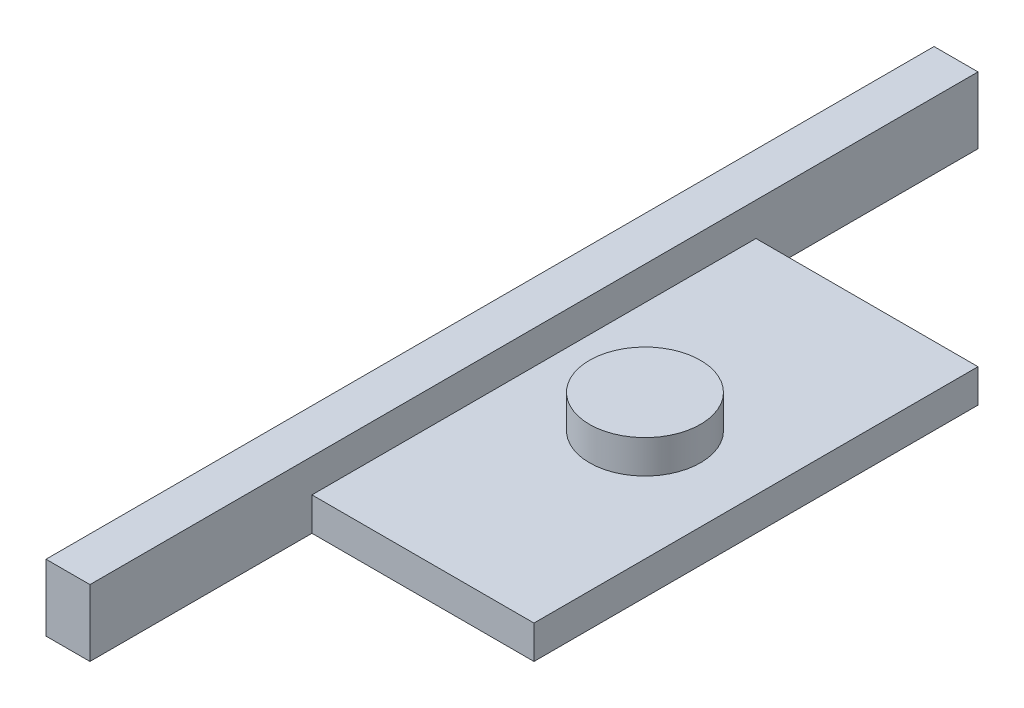
ISO-10303-21;
HEADER;
FILE_DESCRIPTION(('STEP AP214'),'2;1');
FILE_NAME('part.step','',(''),(''),'','','');
FILE_SCHEMA(('AUTOMOTIVE_DESIGN { 1 0 10303 214 1 1 1 1 }'));
ENDSEC;
DATA;
#1=APPLICATION_CONTEXT('core data for automotive mechanical design processes');
#2=APPLICATION_PROTOCOL_DEFINITION('international standard','automotive_design',2000,#1);
#3=PRODUCT_CONTEXT('',#1,'mechanical');
#4=PRODUCT('Part','Part','',(#3));
#5=PRODUCT_RELATED_PRODUCT_CATEGORY('part','',(#4));
#6=PRODUCT_DEFINITION_FORMATION('','',#4);
#7=PRODUCT_DEFINITION_CONTEXT('part definition',#1,'design');
#8=PRODUCT_DEFINITION('design','',#6,#7);
#9=PRODUCT_DEFINITION_SHAPE('','',#8);
#10=(LENGTH_UNIT() NAMED_UNIT(*) SI_UNIT(.MILLI.,.METRE.));
#11=(NAMED_UNIT(*) PLANE_ANGLE_UNIT() SI_UNIT($,.RADIAN.));
#12=(NAMED_UNIT(*) SI_UNIT($,.STERADIAN.) SOLID_ANGLE_UNIT());
#13=UNCERTAINTY_MEASURE_WITH_UNIT(LENGTH_MEASURE(1.E-05),#10,'distance_accuracy_value','');
#14=(GEOMETRIC_REPRESENTATION_CONTEXT(3) GLOBAL_UNCERTAINTY_ASSIGNED_CONTEXT((#13)) GLOBAL_UNIT_ASSIGNED_CONTEXT((#10,
#11,#12)) REPRESENTATION_CONTEXT('',''));
#15=CARTESIAN_POINT('',(0.,0.,0.));
#16=DIRECTION('',(0.,0.,1.));
#17=DIRECTION('',(1.,0.,0.));
#18=AXIS2_PLACEMENT_3D('',#15,#16,#17);
#19=CARTESIAN_POINT('',(75.,3.,10.));
#20=DIRECTION('',(0.,0.,-1.));
#21=DIRECTION('',(-1.,0.,0.));
#22=AXIS2_PLACEMENT_3D('',#19,#20,#21);
#23=PLANE('',#22);
#24=DIRECTION('',(1.,0.,0.));
#25=VECTOR('',#24,1.);
#26=CARTESIAN_POINT('',(75.,1.5,10.));
#27=LINE('',#26,#25);
#28=CARTESIAN_POINT('',(65.,1.5,10.));
#29=VERTEX_POINT('',#28);
#30=CARTESIAN_POINT('',(75.,1.5,10.));
#31=VERTEX_POINT('',#30);
#32=EDGE_CURVE('E134',#29,#31,#27,.T.);
#33=ORIENTED_EDGE('',*,*,#32,.F.);
#34=DIRECTION('',(0.,-1.,0.));
#35=VECTOR('',#34,1.);
#36=CARTESIAN_POINT('',(65.,3.,10.));
#37=LINE('',#36,#35);
#38=CARTESIAN_POINT('',(65.,0.,10.));
#39=VERTEX_POINT('',#38);
#40=EDGE_CURVE('E154',#29,#39,#37,.T.);
#41=ORIENTED_EDGE('',*,*,#40,.T.);
#42=DIRECTION('',(1.,0.,0.));
#43=VECTOR('',#42,1.);
#44=CARTESIAN_POINT('',(75.,0.,10.));
#45=LINE('',#44,#43);
#46=CARTESIAN_POINT('',(75.,0.,10.));
#47=VERTEX_POINT('',#46);
#48=EDGE_CURVE('E141',#39,#47,#45,.T.);
#49=ORIENTED_EDGE('',*,*,#48,.T.);
#50=DIRECTION('',(0.,-1.,0.));
#51=VECTOR('',#50,1.);
#52=CARTESIAN_POINT('',(75.,3.,10.));
#53=LINE('',#52,#51);
#54=EDGE_CURVE('E152',#31,#47,#53,.T.);
#55=ORIENTED_EDGE('',*,*,#54,.F.);
#56=EDGE_LOOP('',(#33,#41,#49,#55));
#57=FACE_BOUND('',#56,.T.);
#58=ADVANCED_FACE('F40',(#57),#23,.F.);
#59=CARTESIAN_POINT('',(75.,3.,-10.));
#60=DIRECTION('',(-1.,0.,0.));
#61=DIRECTION('',(0.,0.,1.));
#62=AXIS2_PLACEMENT_3D('',#59,#60,#61);
#63=PLANE('',#62);
#64=DIRECTION('',(0.,0.,-1.));
#65=VECTOR('',#64,1.);
#66=CARTESIAN_POINT('',(75.,1.5,10.));
#67=LINE('',#66,#65);
#68=CARTESIAN_POINT('',(75.,1.5,-10.));
#69=VERTEX_POINT('',#68);
#70=EDGE_CURVE('E62',#31,#69,#67,.T.);
#71=ORIENTED_EDGE('',*,*,#70,.F.);
#72=ORIENTED_EDGE('',*,*,#54,.T.);
#73=DIRECTION('',(0.,0.,-1.));
#74=VECTOR('',#73,1.);
#75=CARTESIAN_POINT('',(75.,0.,-10.));
#76=LINE('',#75,#74);
#77=CARTESIAN_POINT('',(75.,0.,-10.));
#78=VERTEX_POINT('',#77);
#79=EDGE_CURVE('E144',#47,#78,#76,.T.);
#80=ORIENTED_EDGE('',*,*,#79,.T.);
#81=DIRECTION('',(0.,-1.,0.));
#82=VECTOR('',#81,1.);
#83=CARTESIAN_POINT('',(75.,3.,-10.));
#84=LINE('',#83,#82);
#85=EDGE_CURVE('E150',#69,#78,#84,.T.);
#86=ORIENTED_EDGE('',*,*,#85,.F.);
#87=EDGE_LOOP('',(#71,#72,#80,#86));
#88=FACE_BOUND('',#87,.T.);
#89=ADVANCED_FACE('F186',(#88),#63,.F.);
#90=CARTESIAN_POINT('',(65.,3.,-10.));
#91=DIRECTION('',(0.,0.,1.));
#92=DIRECTION('',(1.,0.,0.));
#93=AXIS2_PLACEMENT_3D('',#90,#91,#92);
#94=PLANE('',#93);
#95=DIRECTION('',(-1.,0.,0.));
#96=VECTOR('',#95,1.);
#97=CARTESIAN_POINT('',(75.,1.5,-10.));
#98=LINE('',#97,#96);
#99=CARTESIAN_POINT('',(65.,1.5,-10.));
#100=VERTEX_POINT('',#99);
#101=EDGE_CURVE('E176',#69,#100,#98,.T.);
#102=ORIENTED_EDGE('',*,*,#101,.F.);
#103=ORIENTED_EDGE('',*,*,#85,.T.);
#104=DIRECTION('',(-1.,0.,0.));
#105=VECTOR('',#104,1.);
#106=CARTESIAN_POINT('',(65.,0.,-10.));
#107=LINE('',#106,#105);
#108=CARTESIAN_POINT('',(65.,0.,-10.));
#109=VERTEX_POINT('',#108);
#110=EDGE_CURVE('E127',#78,#109,#107,.T.);
#111=ORIENTED_EDGE('',*,*,#110,.T.);
#112=DIRECTION('',(0.,-1.,0.));
#113=VECTOR('',#112,1.);
#114=CARTESIAN_POINT('',(65.,3.,-10.));
#115=LINE('',#114,#113);
#116=EDGE_CURVE('E125',#100,#109,#115,.T.);
#117=ORIENTED_EDGE('',*,*,#116,.F.);
#118=EDGE_LOOP('',(#102,#103,#111,#117));
#119=FACE_BOUND('',#118,.T.);
#120=ADVANCED_FACE('F203',(#119),#94,.F.);
#121=CARTESIAN_POINT('',(0.,3.,0.));
#122=DIRECTION('',(0.,-1.,0.));
#123=DIRECTION('',(0.,0.,-1.));
#124=AXIS2_PLACEMENT_3D('',#121,#122,#123);
#125=PLANE('',#124);
#126=DIRECTION('',(-1.,0.,0.));
#127=VECTOR('',#126,1.);
#128=CARTESIAN_POINT('',(-65.,3.,-20.));
#129=LINE('',#128,#127);
#130=CARTESIAN_POINT('',(65.,3.,-20.));
#131=VERTEX_POINT('',#130);
#132=CARTESIAN_POINT('',(63.0204832080686,3.,-20.));
#133=VERTEX_POINT('',#132);
#134=EDGE_CURVE('E115',#131,#133,#129,.T.);
#135=ORIENTED_EDGE('',*,*,#134,.T.);
#136=DIRECTION('',(0.,0.,1.));
#137=VECTOR('',#136,1.);
#138=CARTESIAN_POINT('',(63.0204832080686,3.,0.));
#139=LINE('',#138,#137);
#140=CARTESIAN_POINT('',(63.0204832080686,3.,20.));
#141=VERTEX_POINT('',#140);
#142=EDGE_CURVE('E103',#133,#141,#139,.T.);
#143=ORIENTED_EDGE('',*,*,#142,.T.);
#144=DIRECTION('',(1.,0.,0.));
#145=VECTOR('',#144,1.);
#146=CARTESIAN_POINT('',(-65.,3.,20.));
#147=LINE('',#146,#145);
#148=CARTESIAN_POINT('',(65.,3.,20.));
#149=VERTEX_POINT('',#148);
#150=EDGE_CURVE('E123',#141,#149,#147,.T.);
#151=ORIENTED_EDGE('',*,*,#150,.T.);
#152=DIRECTION('',(0.,0.,-1.));
#153=VECTOR('',#152,1.);
#154=CARTESIAN_POINT('',(65.,3.,-10.));
#155=LINE('',#154,#153);
#156=EDGE_CURVE('E121',#149,#131,#155,.T.);
#157=ORIENTED_EDGE('',*,*,#156,.T.);
#158=EDGE_LOOP('',(#135,#143,#151,#157));
#159=FACE_BOUND('',#158,.T.);
#160=ADVANCED_FACE('F119',(#159),#125,.F.);
#161=CARTESIAN_POINT('',(0.,0.,0.));
#162=DIRECTION('',(0.,-1.,0.));
#163=DIRECTION('',(0.,0.,-1.));
#164=AXIS2_PLACEMENT_3D('',#161,#162,#163);
#165=PLANE('',#164);
#166=DIRECTION('',(0.,0.,1.));
#167=VECTOR('',#166,1.);
#168=CARTESIAN_POINT('',(63.0204832080686,0.,0.));
#169=LINE('',#168,#167);
#170=CARTESIAN_POINT('',(63.0204832080686,0.,-20.));
#171=VERTEX_POINT('',#170);
#172=CARTESIAN_POINT('',(63.0204832080686,0.,20.));
#173=VERTEX_POINT('',#172);
#174=EDGE_CURVE('E55',#171,#173,#169,.T.);
#175=ORIENTED_EDGE('',*,*,#174,.F.);
#176=DIRECTION('',(-1.,0.,0.));
#177=VECTOR('',#176,1.);
#178=CARTESIAN_POINT('',(-65.,0.,-20.));
#179=LINE('',#178,#177);
#180=CARTESIAN_POINT('',(65.,0.,-20.));
#181=VERTEX_POINT('',#180);
#182=EDGE_CURVE('E117',#181,#171,#179,.T.);
#183=ORIENTED_EDGE('',*,*,#182,.F.);
#184=DIRECTION('',(0.,0.,-1.));
#185=VECTOR('',#184,1.);
#186=CARTESIAN_POINT('',(65.,0.,-10.));
#187=LINE('',#186,#185);
#188=EDGE_CURVE('E131',#109,#181,#187,.T.);
#189=ORIENTED_EDGE('',*,*,#188,.F.);
#190=ORIENTED_EDGE('',*,*,#110,.F.);
#191=ORIENTED_EDGE('',*,*,#79,.F.);
#192=ORIENTED_EDGE('',*,*,#48,.F.);
#193=DIRECTION('',(0.,0.,-1.));
#194=VECTOR('',#193,1.);
#195=CARTESIAN_POINT('',(65.,0.,20.));
#196=LINE('',#195,#194);
#197=CARTESIAN_POINT('',(65.,0.,20.));
#198=VERTEX_POINT('',#197);
#199=EDGE_CURVE('E138',#198,#39,#196,.T.);
#200=ORIENTED_EDGE('',*,*,#199,.F.);
#201=DIRECTION('',(1.,0.,0.));
#202=VECTOR('',#201,1.);
#203=CARTESIAN_POINT('',(-65.,0.,20.));
#204=LINE('',#203,#202);
#205=EDGE_CURVE('E136',#173,#198,#204,.T.);
#206=ORIENTED_EDGE('',*,*,#205,.F.);
#207=EDGE_LOOP('',(#175,#183,#189,#190,#191,#192,#200,#206));
#208=FACE_BOUND('',#207,.T.);
#209=ADVANCED_FACE('F164',(#208),#165,.T.);
#210=CARTESIAN_POINT('',(-65.,3.,-20.));
#211=DIRECTION('',(0.,0.,1.));
#212=DIRECTION('',(1.,0.,0.));
#213=AXIS2_PLACEMENT_3D('',#210,#211,#212);
#214=PLANE('',#213);
#215=ORIENTED_EDGE('',*,*,#182,.T.);
#216=DIRECTION('',(0.,-1.,0.));
#217=VECTOR('',#216,1.);
#218=CARTESIAN_POINT('',(63.0204832080686,13.,-20.));
#219=LINE('',#218,#217);
#220=EDGE_CURVE('E106',#133,#171,#219,.T.);
#221=ORIENTED_EDGE('',*,*,#220,.F.);
#222=ORIENTED_EDGE('',*,*,#134,.F.);
#223=DIRECTION('',(0.,-1.,0.));
#224=VECTOR('',#223,1.);
#225=CARTESIAN_POINT('',(65.,3.,-20.));
#226=LINE('',#225,#224);
#227=EDGE_CURVE('E48',#131,#181,#226,.T.);
#228=ORIENTED_EDGE('',*,*,#227,.T.);
#229=EDGE_LOOP('',(#215,#221,#222,#228));
#230=FACE_BOUND('',#229,.T.);
#231=ADVANCED_FACE('F42',(#230),#214,.F.);
#232=CARTESIAN_POINT('',(-65.,3.,20.));
#233=DIRECTION('',(0.,0.,-1.));
#234=DIRECTION('',(-1.,0.,0.));
#235=AXIS2_PLACEMENT_3D('',#232,#233,#234);
#236=PLANE('',#235);
#237=ORIENTED_EDGE('',*,*,#150,.F.);
#238=DIRECTION('',(0.,-1.,0.));
#239=VECTOR('',#238,1.);
#240=CARTESIAN_POINT('',(63.0204832080686,3.,20.));
#241=LINE('',#240,#239);
#242=EDGE_CURVE('E12',#141,#173,#241,.T.);
#243=ORIENTED_EDGE('',*,*,#242,.T.);
#244=ORIENTED_EDGE('',*,*,#205,.T.);
#245=DIRECTION('',(0.,-1.,0.));
#246=VECTOR('',#245,1.);
#247=CARTESIAN_POINT('',(65.,3.,20.));
#248=LINE('',#247,#246);
#249=EDGE_CURVE('E156',#149,#198,#248,.T.);
#250=ORIENTED_EDGE('',*,*,#249,.F.);
#251=EDGE_LOOP('',(#237,#243,#244,#250));
#252=FACE_BOUND('',#251,.T.);
#253=ADVANCED_FACE('F190',(#252),#236,.F.);
#254=CARTESIAN_POINT('',(65.,3.,20.));
#255=DIRECTION('',(-1.,0.,0.));
#256=DIRECTION('',(0.,0.,1.));
#257=AXIS2_PLACEMENT_3D('',#254,#255,#256);
#258=PLANE('',#257);
#259=ORIENTED_EDGE('',*,*,#199,.T.);
#260=ORIENTED_EDGE('',*,*,#40,.F.);
#261=DIRECTION('',(0.,0.,1.));
#262=VECTOR('',#261,1.);
#263=CARTESIAN_POINT('',(65.,1.5,10.));
#264=LINE('',#263,#262);
#265=EDGE_CURVE('E178',#100,#29,#264,.T.);
#266=ORIENTED_EDGE('',*,*,#265,.F.);
#267=ORIENTED_EDGE('',*,*,#116,.T.);
#268=ORIENTED_EDGE('',*,*,#188,.T.);
#269=ORIENTED_EDGE('',*,*,#227,.F.);
#270=ORIENTED_EDGE('',*,*,#156,.F.);
#271=ORIENTED_EDGE('',*,*,#249,.T.);
#272=EDGE_LOOP('',(#259,#260,#266,#267,#268,#269,#270,#271));
#273=FACE_BOUND('',#272,.T.);
#274=ADVANCED_FACE('F160',(#273),#258,.F.);
#275=CARTESIAN_POINT('',(0.,1.5,0.));
#276=DIRECTION('',(0.,1.,0.));
#277=DIRECTION('',(0.,0.,1.));
#278=AXIS2_PLACEMENT_3D('',#275,#276,#277);
#279=PLANE('',#278);
#280=CARTESIAN_POINT('',(70.,1.5,0.));
#281=DIRECTION('',(0.,1.,0.));
#282=DIRECTION('',(0.,0.,1.));
#283=AXIS2_PLACEMENT_3D('',#280,#281,#282);
#284=CIRCLE('',#283,2.5);
#285=CARTESIAN_POINT('',(70.,1.5,2.5));
#286=VERTEX_POINT('',#285);
#287=EDGE_CURVE('E170',#286,#286,#284,.T.);
#288=ORIENTED_EDGE('',*,*,#287,.F.);
#289=EDGE_LOOP('',(#288));
#290=FACE_BOUND('',#289,.T.);
#291=ORIENTED_EDGE('',*,*,#70,.T.);
#292=ORIENTED_EDGE('',*,*,#101,.T.);
#293=ORIENTED_EDGE('',*,*,#265,.T.);
#294=ORIENTED_EDGE('',*,*,#32,.T.);
#295=EDGE_LOOP('',(#291,#292,#293,#294));
#296=FACE_BOUND('',#295,.T.);
#297=ADVANCED_FACE('F180',(#290,#296),#279,.T.);
#298=CARTESIAN_POINT('',(70.,1.5,0.));
#299=DIRECTION('',(0.,1.,0.));
#300=DIRECTION('',(0.,0.,1.));
#301=AXIS2_PLACEMENT_3D('',#298,#299,#300);
#302=CYLINDRICAL_SURFACE('',#301,2.5);
#303=ORIENTED_EDGE('',*,*,#287,.T.);
#304=EDGE_LOOP('',(#303));
#305=FACE_BOUND('',#304,.T.);
#306=CARTESIAN_POINT('',(70.,3.,0.));
#307=DIRECTION('',(0.,1.,0.));
#308=DIRECTION('',(0.,0.,1.));
#309=AXIS2_PLACEMENT_3D('',#306,#307,#308);
#310=CIRCLE('',#309,2.5);
#311=CARTESIAN_POINT('',(70.,3.,2.5));
#312=VERTEX_POINT('',#311);
#313=EDGE_CURVE('E110',#312,#312,#310,.T.);
#314=ORIENTED_EDGE('',*,*,#313,.F.);
#315=EDGE_LOOP('',(#314));
#316=FACE_BOUND('',#315,.T.);
#317=ADVANCED_FACE('F216',(#305,#316),#302,.T.);
#318=ORIENTED_EDGE('',*,*,#313,.T.);
#319=EDGE_LOOP('',(#318));
#320=FACE_BOUND('',#319,.T.);
#321=ADVANCED_FACE('F213',(#320),#125,.F.);
#322=CARTESIAN_POINT('',(63.0204832080686,13.,-20.));
#323=DIRECTION('',(1.,0.,0.));
#324=DIRECTION('',(0.,0.,-1.));
#325=AXIS2_PLACEMENT_3D('',#322,#323,#324);
#326=PLANE('',#325);
#327=ORIENTED_EDGE('',*,*,#220,.T.);
#328=ORIENTED_EDGE('',*,*,#174,.T.);
#329=ORIENTED_EDGE('',*,*,#242,.F.);
#330=ORIENTED_EDGE('',*,*,#142,.F.);
#331=EDGE_LOOP('',(#327,#328,#329,#330));
#332=FACE_BOUND('',#331,.T.);
#333=ADVANCED_FACE('F105',(#332),#326,.F.);
#334=CLOSED_SHELL('',(#58,#89,#120,#160,#209,#231,#253,#274,#297,#317,#321,#333));
#335=MANIFOLD_SOLID_BREP('B2',#334);
#336=ADVANCED_BREP_SHAPE_REPRESENTATION('',(#18,#335),#14);
#337=SHAPE_DEFINITION_REPRESENTATION(#9,#336);
ENDSEC;
END-ISO-10303-21;
